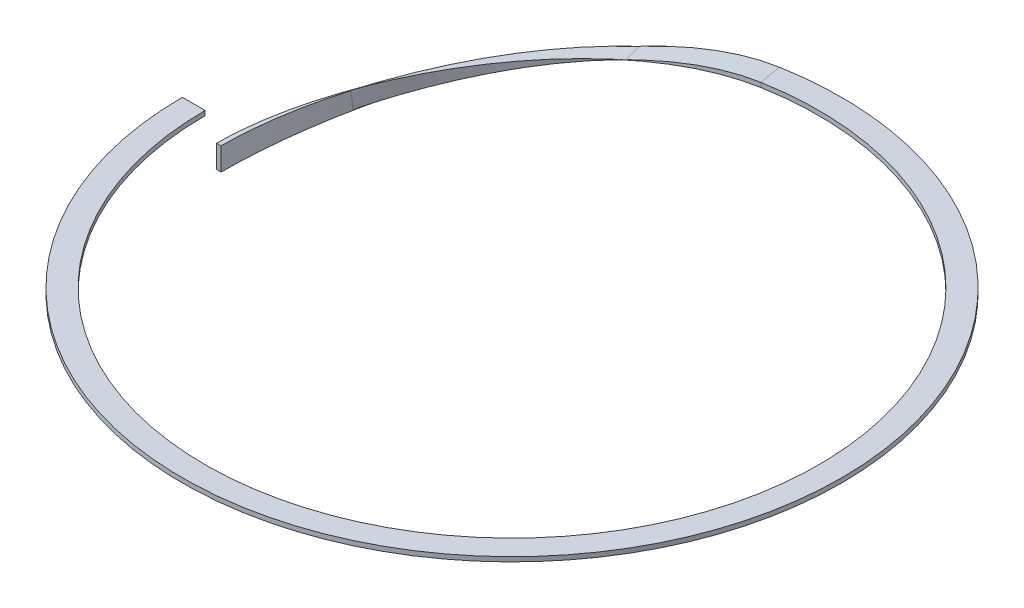
ISO-10303-21;
HEADER;
FILE_DESCRIPTION(('STEP AP214'),'2;1');
FILE_NAME('part.step','',(''),(''),'','','');
FILE_SCHEMA(('AUTOMOTIVE_DESIGN { 1 0 10303 214 1 1 1 1 }'));
ENDSEC;
DATA;
#1=APPLICATION_CONTEXT('core data for automotive mechanical design processes');
#2=APPLICATION_PROTOCOL_DEFINITION('international standard','automotive_design',2000,#1);
#3=PRODUCT_CONTEXT('',#1,'mechanical');
#4=PRODUCT('Part','Part','',(#3));
#5=PRODUCT_RELATED_PRODUCT_CATEGORY('part','',(#4));
#6=PRODUCT_DEFINITION_FORMATION('','',#4);
#7=PRODUCT_DEFINITION_CONTEXT('part definition',#1,'design');
#8=PRODUCT_DEFINITION('design','',#6,#7);
#9=PRODUCT_DEFINITION_SHAPE('','',#8);
#10=(LENGTH_UNIT() NAMED_UNIT(*) SI_UNIT(.MILLI.,.METRE.));
#11=(NAMED_UNIT(*) PLANE_ANGLE_UNIT() SI_UNIT($,.RADIAN.));
#12=(NAMED_UNIT(*) SI_UNIT($,.STERADIAN.) SOLID_ANGLE_UNIT());
#13=UNCERTAINTY_MEASURE_WITH_UNIT(LENGTH_MEASURE(1.E-05),#10,'distance_accuracy_value','');
#14=(GEOMETRIC_REPRESENTATION_CONTEXT(3) GLOBAL_UNCERTAINTY_ASSIGNED_CONTEXT((#13)) GLOBAL_UNIT_ASSIGNED_CONTEXT((#10,
#11,#12)) REPRESENTATION_CONTEXT('',''));
#15=CARTESIAN_POINT('',(0.,0.,0.));
#16=DIRECTION('',(0.,0.,1.));
#17=DIRECTION('',(1.,0.,0.));
#18=AXIS2_PLACEMENT_3D('',#15,#16,#17);
#19=CARTESIAN_POINT('',(0.,0.,0.));
#20=DIRECTION('',(0.,-1.,0.));
#21=DIRECTION('',(0.,0.,-1.));
#22=AXIS2_PLACEMENT_3D('',#19,#20,#21);
#23=CYLINDRICAL_SURFACE('',#22,135.);
#24=CARTESIAN_POINT('',(0.,-0.999999999999994,0.));
#25=DIRECTION('',(0.,-1.,0.));
#26=DIRECTION('',(0.,0.,-1.));
#27=AXIS2_PLACEMENT_3D('',#24,#25,#26);
#28=CIRCLE('',#27,135.);
#29=CARTESIAN_POINT('',(-23.4425039850371,-0.999999999999994,-132.949046656648));
#30=VERTEX_POINT('',#29);
#31=CARTESIAN_POINT('',(-135.,-0.999999999999994,0.));
#32=VERTEX_POINT('',#31);
#33=EDGE_CURVE('E12',#30,#32,#28,.T.);
#34=ORIENTED_EDGE('',*,*,#33,.T.);
#35=DIRECTION('',(0.,1.,0.));
#36=VECTOR('',#35,1.);
#37=CARTESIAN_POINT('',(-135.,-0.999999999999994,0.));
#38=LINE('',#37,#36);
#39=CARTESIAN_POINT('',(-135.,1.00000000000001,0.));
#40=VERTEX_POINT('',#39);
#41=EDGE_CURVE('E187',#32,#40,#38,.T.);
#42=ORIENTED_EDGE('',*,*,#41,.T.);
#43=CARTESIAN_POINT('',(0.,1.00000000000001,0.));
#44=DIRECTION('',(0.,-1.,0.));
#45=DIRECTION('',(0.,0.,-1.));
#46=AXIS2_PLACEMENT_3D('',#43,#44,#45);
#47=CIRCLE('',#46,135.);
#48=CARTESIAN_POINT('',(-23.4425039850371,1.00000000000001,-132.949046656648));
#49=VERTEX_POINT('',#48);
#50=EDGE_CURVE('E119',#49,#40,#47,.T.);
#51=ORIENTED_EDGE('',*,*,#50,.F.);
#52=DIRECTION('',(0.,-1.,0.));
#53=VECTOR('',#52,1.);
#54=CARTESIAN_POINT('',(-23.4425039850371,0.,-132.949046656648));
#55=LINE('',#54,#53);
#56=EDGE_CURVE('E285',#30,#49,#55,.F.);
#57=ORIENTED_EDGE('',*,*,#56,.F.);
#58=EDGE_LOOP('',(#34,#42,#51,#57));
#59=FACE_BOUND('',#58,.T.);
#60=ADVANCED_FACE('F90',(#59),#23,.F.);
#61=CARTESIAN_POINT('',(-25.1789857617065,-0.999999999999994,-142.79712418677));
#62=DIRECTION('',(0.,1.,0.));
#63=DIRECTION('',(0.,0.,1.));
#64=AXIS2_PLACEMENT_3D('',#61,#62,#63);
#65=PLANE('',#64);
#66=CARTESIAN_POINT('',(0.,-0.999999999999994,0.));
#67=DIRECTION('',(0.,-1.,0.));
#68=DIRECTION('',(0.,0.,-1.));
#69=AXIS2_PLACEMENT_3D('',#66,#67,#68);
#70=CIRCLE('',#69,145.);
#71=CARTESIAN_POINT('',(-25.1789857617065,-0.999999999999994,-142.79712418677));
#72=VERTEX_POINT('',#71);
#73=CARTESIAN_POINT('',(-145.,-0.999999999999994,0.));
#74=VERTEX_POINT('',#73);
#75=EDGE_CURVE('E100',#72,#74,#70,.T.);
#76=ORIENTED_EDGE('',*,*,#75,.T.);
#77=DIRECTION('',(1.,0.,0.));
#78=VECTOR('',#77,1.);
#79=CARTESIAN_POINT('',(-145.,-0.999999999999994,0.));
#80=LINE('',#79,#78);
#81=EDGE_CURVE('E323',#74,#32,#80,.T.);
#82=ORIENTED_EDGE('',*,*,#81,.T.);
#83=ORIENTED_EDGE('',*,*,#33,.F.);
#84=DIRECTION('',(-0.173648177666941,0.,-0.984807753012206));
#85=VECTOR('',#84,1.);
#86=CARTESIAN_POINT('',(-23.4425039850371,-0.999999999999994,-132.949046656648));
#87=LINE('',#86,#85);
#88=EDGE_CURVE('E330',#72,#30,#87,.F.);
#89=ORIENTED_EDGE('',*,*,#88,.F.);
#90=EDGE_LOOP('',(#76,#82,#83,#89));
#91=FACE_BOUND('',#90,.T.);
#92=ADVANCED_FACE('F92',(#91),#65,.F.);
#93=CARTESIAN_POINT('',(0.,0.,0.));
#94=DIRECTION('',(0.,-1.,0.));
#95=DIRECTION('',(0.,0.,-1.));
#96=AXIS2_PLACEMENT_3D('',#93,#94,#95);
#97=CYLINDRICAL_SURFACE('',#96,145.);
#98=CARTESIAN_POINT('',(0.,1.00000000000001,0.));
#99=DIRECTION('',(0.,-1.,0.));
#100=DIRECTION('',(0.,0.,-1.));
#101=AXIS2_PLACEMENT_3D('',#98,#99,#100);
#102=CIRCLE('',#101,145.);
#103=CARTESIAN_POINT('',(-25.1789857617065,1.00000000000001,-142.79712418677));
#104=VERTEX_POINT('',#103);
#105=CARTESIAN_POINT('',(-145.,1.00000000000001,0.));
#106=VERTEX_POINT('',#105);
#107=EDGE_CURVE('E328',#104,#106,#102,.T.);
#108=ORIENTED_EDGE('',*,*,#107,.T.);
#109=DIRECTION('',(0.,-1.,0.));
#110=VECTOR('',#109,1.);
#111=CARTESIAN_POINT('',(-145.,-0.999999999999994,0.));
#112=LINE('',#111,#110);
#113=EDGE_CURVE('E319',#106,#74,#112,.T.);
#114=ORIENTED_EDGE('',*,*,#113,.T.);
#115=ORIENTED_EDGE('',*,*,#75,.F.);
#116=DIRECTION('',(0.,-1.,0.));
#117=VECTOR('',#116,1.);
#118=CARTESIAN_POINT('',(-25.1789857617066,0.,-142.79712418677));
#119=LINE('',#118,#117);
#120=EDGE_CURVE('E94',#104,#72,#119,.T.);
#121=ORIENTED_EDGE('',*,*,#120,.F.);
#122=EDGE_LOOP('',(#108,#114,#115,#121));
#123=FACE_BOUND('',#122,.T.);
#124=ADVANCED_FACE('F336',(#123),#97,.T.);
#125=CARTESIAN_POINT('',(-25.1789857617065,1.00000000000001,-142.79712418677));
#126=DIRECTION('',(0.,-1.,0.));
#127=DIRECTION('',(0.,0.,-1.));
#128=AXIS2_PLACEMENT_3D('',#125,#126,#127);
#129=PLANE('',#128);
#130=DIRECTION('',(0.173648177666941,0.,0.984807753012206));
#131=VECTOR('',#130,1.);
#132=CARTESIAN_POINT('',(-25.1789857617065,1.00000000000001,-142.79712418677));
#133=LINE('',#132,#131);
#134=EDGE_CURVE('E333',#49,#104,#133,.F.);
#135=ORIENTED_EDGE('',*,*,#134,.F.);
#136=ORIENTED_EDGE('',*,*,#50,.T.);
#137=DIRECTION('',(-1.,0.,0.));
#138=VECTOR('',#137,1.);
#139=CARTESIAN_POINT('',(-145.,1.00000000000001,0.));
#140=LINE('',#139,#138);
#141=EDGE_CURVE('E316',#40,#106,#140,.T.);
#142=ORIENTED_EDGE('',*,*,#141,.T.);
#143=ORIENTED_EDGE('',*,*,#107,.F.);
#144=EDGE_LOOP('',(#135,#136,#142,#143));
#145=FACE_BOUND('',#144,.T.);
#146=ADVANCED_FACE('F334',(#145),#129,.F.);
#147=CARTESIAN_POINT('',(0.,0.,0.));
#148=DIRECTION('',(0.,0.,-1.));
#149=DIRECTION('',(-1.,0.,0.));
#150=AXIS2_PLACEMENT_3D('',#147,#148,#149);
#151=PLANE('',#150);
#152=ORIENTED_EDGE('',*,*,#41,.F.);
#153=ORIENTED_EDGE('',*,*,#81,.F.);
#154=ORIENTED_EDGE('',*,*,#113,.F.);
#155=ORIENTED_EDGE('',*,*,#141,.F.);
#156=EDGE_LOOP('',(#152,#153,#154,#155));
#157=FACE_BOUND('',#156,.T.);
#158=ADVANCED_FACE('F198',(#157),#151,.T.);
#159=CARTESIAN_POINT('',(0.,0.,0.));
#160=DIRECTION('',(0.,0.,-1.));
#161=DIRECTION('',(-1.,0.,0.));
#162=AXIS2_PLACEMENT_3D('',#159,#160,#161);
#163=PLANE('',#162);
#164=DIRECTION('',(0.,1.,0.));
#165=VECTOR('',#164,1.);
#166=CARTESIAN_POINT('',(-128.,-8.99999999999999,0.));
#167=LINE('',#166,#165);
#168=CARTESIAN_POINT('',(-128.,-19.,0.));
#169=VERTEX_POINT('',#168);
#170=CARTESIAN_POINT('',(-128.,-8.99999999999999,0.));
#171=VERTEX_POINT('',#170);
#172=EDGE_CURVE('E151',#169,#171,#167,.T.);
#173=ORIENTED_EDGE('',*,*,#172,.T.);
#174=DIRECTION('',(-1.,0.,0.));
#175=VECTOR('',#174,1.);
#176=CARTESIAN_POINT('',(-128.,-8.99999999999999,0.));
#177=LINE('',#176,#175);
#178=CARTESIAN_POINT('',(-130.,-8.99999999999999,0.));
#179=VERTEX_POINT('',#178);
#180=EDGE_CURVE('E161',#171,#179,#177,.T.);
#181=ORIENTED_EDGE('',*,*,#180,.T.);
#182=DIRECTION('',(0.,-1.,0.));
#183=VECTOR('',#182,1.);
#184=CARTESIAN_POINT('',(-130.,-8.99999999999999,0.));
#185=LINE('',#184,#183);
#186=CARTESIAN_POINT('',(-130.,-19.,0.));
#187=VERTEX_POINT('',#186);
#188=EDGE_CURVE('E169',#179,#187,#185,.T.);
#189=ORIENTED_EDGE('',*,*,#188,.T.);
#190=DIRECTION('',(1.,0.,0.));
#191=VECTOR('',#190,1.);
#192=CARTESIAN_POINT('',(-128.,-19.,0.));
#193=LINE('',#192,#191);
#194=EDGE_CURVE('E176',#187,#169,#193,.T.);
#195=ORIENTED_EDGE('',*,*,#194,.T.);
#196=EDGE_LOOP('',(#173,#181,#189,#195));
#197=FACE_BOUND('',#196,.T.);
#198=ADVANCED_FACE('F174',(#197),#163,.F.);
#199=CARTESIAN_POINT('',(-23.4425039850371,1.00000000000001,-132.949046656648));
#200=CARTESIAN_POINT('',(-79.7576168349461,1.00000000000001,-123.019172839566));
#201=CARTESIAN_POINT('',(-130.,-19.,-57.1838642391466));
#202=CARTESIAN_POINT('',(-130.,-19.,0.));
#203=CARTESIAN_POINT('',(-24.0213312439269,1.00000000000001,-136.231739166689));
#204=CARTESIAN_POINT('',(-80.9431878305732,1.00000000000001,-126.194880058444));
#205=CARTESIAN_POINT('',(-129.333333333333,-19.,-57.7999679760246));
#206=CARTESIAN_POINT('',(-129.333333333333,-19.,0.));
#207=CARTESIAN_POINT('',(-24.6001585028167,1.00000000000001,-139.514431676729));
#208=CARTESIAN_POINT('',(-82.1287588262002,1.00000000000001,-129.370587277322));
#209=CARTESIAN_POINT('',(-128.666666666667,-19.,-58.4160717129026));
#210=CARTESIAN_POINT('',(-128.666666666667,-19.,0.));
#211=CARTESIAN_POINT('',(-25.1789857617065,1.00000000000001,-142.79712418677));
#212=CARTESIAN_POINT('',(-83.3143298218273,1.00000000000001,-132.5462944962));
#213=CARTESIAN_POINT('',(-128.,-19.,-59.0321754497806));
#214=CARTESIAN_POINT('',(-128.,-19.,0.));
#215=B_SPLINE_SURFACE_WITH_KNOTS('',3,3,((#199,#200,#201,#202),(#203,#204,#205,#206),(#207,#208,
#209,#210),(#211,#212,#213,#214)),.UNSPECIFIED.,.F.,.F.,.F.,(4,4),(4,4),(0.,1.),(0.,1.),.UNSPECIFIED.);
#216=CARTESIAN_POINT('',(-25.1789857617065,1.00000000000001,-142.79712418677));
#217=CARTESIAN_POINT('',(-83.3143298218273,1.00000000000001,-132.5462944962));
#218=CARTESIAN_POINT('',(-128.,-19.,-59.0321754497806));
#219=CARTESIAN_POINT('',(-128.,-19.,0.));
#220=B_SPLINE_CURVE_WITH_KNOTS('',3,(#216,#217,#218,#219),.UNSPECIFIED.,.F.,.F.,(4,4),(0.,1.),.UNSPECIFIED.);
#221=EDGE_CURVE('E158',#104,#169,#220,.T.);
#222=CARTESIAN_POINT('',(-23.4425039850371,1.00000000000001,-132.949046656648));
#223=CARTESIAN_POINT('',(-79.7576168349461,1.00000000000001,-123.019172839566));
#224=CARTESIAN_POINT('',(-130.,-19.,-57.1838642391466));
#225=CARTESIAN_POINT('',(-130.,-19.,0.));
#226=B_SPLINE_CURVE_WITH_KNOTS('',3,(#222,#223,#224,#225),.UNSPECIFIED.,.F.,.F.,(4,4),(0.,1.),.UNSPECIFIED.);
#227=EDGE_CURVE('E168',#187,#49,#226,.F.);
#228=ORIENTED_EDGE('',*,*,#134,.T.);
#229=ORIENTED_EDGE('',*,*,#221,.T.);
#230=ORIENTED_EDGE('',*,*,#194,.F.);
#231=ORIENTED_EDGE('',*,*,#227,.T.);
#232=EDGE_LOOP('',(#228,#229,#230,#231));
#233=FACE_BOUND('',#232,.T.);
#234=ADVANCED_FACE('F197',(#233),#215,.T.);
#235=CARTESIAN_POINT('',(-25.1789857617065,1.00000000000001,-142.79712418677));
#236=CARTESIAN_POINT('',(-83.3143298218273,1.00000000000001,-132.5462944962));
#237=CARTESIAN_POINT('',(-128.,-19.,-59.0321754497806));
#238=CARTESIAN_POINT('',(-128.,-19.,0.));
#239=CARTESIAN_POINT('',(-25.1789857617065,0.33333333333334,-142.79712418677));
#240=CARTESIAN_POINT('',(-83.210247718438,0.33333333333334,-132.564646979237));
#241=CARTESIAN_POINT('',(-128.,-15.6666666666667,-58.9264877121781));
#242=CARTESIAN_POINT('',(-128.,-15.6666666666667,0.));
#243=CARTESIAN_POINT('',(-25.1789857617065,-0.333333333333327,-142.79712418677));
#244=CARTESIAN_POINT('',(-83.1061656150487,-0.333333333333327,-132.582999462273));
#245=CARTESIAN_POINT('',(-128.,-12.3333333333333,-58.8207999745756));
#246=CARTESIAN_POINT('',(-128.,-12.3333333333333,0.));
#247=CARTESIAN_POINT('',(-25.1789857617065,-0.999999999999994,-142.79712418677));
#248=CARTESIAN_POINT('',(-83.0020835116595,-0.999999999999994,-132.60135194531));
#249=CARTESIAN_POINT('',(-128.,-8.99999999999999,-58.7151122369731));
#250=CARTESIAN_POINT('',(-128.,-8.99999999999999,0.));
#251=B_SPLINE_SURFACE_WITH_KNOTS('',3,3,((#235,#236,#237,#238),(#239,#240,#241,#242),(#243,#244,
#245,#246),(#247,#248,#249,#250)),.UNSPECIFIED.,.F.,.F.,.F.,(4,4),(4,4),(0.,1.),(0.,1.),.UNSPECIFIED.);
#252=CARTESIAN_POINT('',(-25.1789857617065,-0.999999999999994,-142.79712418677));
#253=CARTESIAN_POINT('',(-83.0020835116595,-0.999999999999994,-132.60135194531));
#254=CARTESIAN_POINT('',(-128.,-8.99999999999999,-58.7151122369731));
#255=CARTESIAN_POINT('',(-128.,-8.99999999999999,0.));
#256=B_SPLINE_CURVE_WITH_KNOTS('',3,(#252,#253,#254,#255),.UNSPECIFIED.,.F.,.F.,(4,4),(0.,1.),.UNSPECIFIED.);
#257=EDGE_CURVE('E146',#72,#171,#256,.T.);
#258=ORIENTED_EDGE('',*,*,#120,.T.);
#259=ORIENTED_EDGE('',*,*,#257,.T.);
#260=ORIENTED_EDGE('',*,*,#172,.F.);
#261=ORIENTED_EDGE('',*,*,#221,.F.);
#262=EDGE_LOOP('',(#258,#259,#260,#261));
#263=FACE_BOUND('',#262,.T.);
#264=ADVANCED_FACE('F148',(#263),#251,.T.);
#265=CARTESIAN_POINT('',(-23.4425039850371,-0.999999999999994,-132.949046656648));
#266=CARTESIAN_POINT('',(-79.435220830266,-0.999999999999994,-123.076019953664));
#267=CARTESIAN_POINT('',(-130.,-8.99999999999999,-56.8564947564288));
#268=CARTESIAN_POINT('',(-130.,-8.99999999999999,0.));
#269=CARTESIAN_POINT('',(-23.4425039850371,-0.333333333333327,-132.949046656648));
#270=CARTESIAN_POINT('',(-79.5426861651594,-0.333333333333327,-123.057070915631));
#271=CARTESIAN_POINT('',(-130.,-12.3333333333333,-56.9656179173348));
#272=CARTESIAN_POINT('',(-130.,-12.3333333333333,0.));
#273=CARTESIAN_POINT('',(-23.4425039850371,0.33333333333334,-132.949046656648));
#274=CARTESIAN_POINT('',(-79.6501515000528,0.33333333333334,-123.038121877599));
#275=CARTESIAN_POINT('',(-130.,-15.6666666666667,-57.0747410782407));
#276=CARTESIAN_POINT('',(-130.,-15.6666666666667,0.));
#277=CARTESIAN_POINT('',(-23.4425039850371,1.00000000000001,-132.949046656648));
#278=CARTESIAN_POINT('',(-79.7576168349461,1.00000000000001,-123.019172839566));
#279=CARTESIAN_POINT('',(-130.,-19.,-57.1838642391466));
#280=CARTESIAN_POINT('',(-130.,-19.,0.));
#281=B_SPLINE_SURFACE_WITH_KNOTS('',3,3,((#265,#266,#267,#268),(#269,#270,#271,#272),(#273,#274,
#275,#276),(#277,#278,#279,#280)),.UNSPECIFIED.,.F.,.F.,.F.,(4,4),(4,4),(0.,1.),(0.,1.),.UNSPECIFIED.);
#282=CARTESIAN_POINT('',(-23.4425039850371,-0.999999999999994,-132.949046656648));
#283=CARTESIAN_POINT('',(-79.435220830266,-0.999999999999994,-123.076019953664));
#284=CARTESIAN_POINT('',(-130.,-8.99999999999999,-56.8564947564288));
#285=CARTESIAN_POINT('',(-130.,-8.99999999999999,0.));
#286=B_SPLINE_CURVE_WITH_KNOTS('',3,(#282,#283,#284,#285),.UNSPECIFIED.,.F.,.F.,(4,4),(0.,1.),.UNSPECIFIED.);
#287=EDGE_CURVE('E157',#30,#179,#286,.T.);
#288=ORIENTED_EDGE('',*,*,#56,.T.);
#289=ORIENTED_EDGE('',*,*,#227,.F.);
#290=ORIENTED_EDGE('',*,*,#188,.F.);
#291=ORIENTED_EDGE('',*,*,#287,.F.);
#292=EDGE_LOOP('',(#288,#289,#290,#291));
#293=FACE_BOUND('',#292,.T.);
#294=ADVANCED_FACE('F242',(#293),#281,.T.);
#295=CARTESIAN_POINT('',(-25.1789857617065,-0.999999999999994,-142.79712418677));
#296=CARTESIAN_POINT('',(-83.0020835116595,-0.999999999999994,-132.60135194531));
#297=CARTESIAN_POINT('',(-128.,-8.99999999999999,-58.7151122369731));
#298=CARTESIAN_POINT('',(-128.,-8.99999999999999,0.));
#299=CARTESIAN_POINT('',(-24.6001585028167,-0.999999999999994,-139.514431676729));
#300=CARTESIAN_POINT('',(-81.8131292845283,-0.999999999999994,-129.426241281428));
#301=CARTESIAN_POINT('',(-128.666666666667,-8.99999999999999,-58.0955730767917));
#302=CARTESIAN_POINT('',(-128.666666666667,-8.99999999999999,0.));
#303=CARTESIAN_POINT('',(-24.0213312439269,-0.999999999999994,-136.231739166689));
#304=CARTESIAN_POINT('',(-80.6241750573972,-0.999999999999994,-126.251130617546));
#305=CARTESIAN_POINT('',(-129.333333333333,-8.99999999999999,-57.4760339166102));
#306=CARTESIAN_POINT('',(-129.333333333333,-8.99999999999999,0.));
#307=CARTESIAN_POINT('',(-23.4425039850371,-0.999999999999994,-132.949046656648));
#308=CARTESIAN_POINT('',(-79.435220830266,-0.999999999999994,-123.076019953664));
#309=CARTESIAN_POINT('',(-130.,-8.99999999999999,-56.8564947564288));
#310=CARTESIAN_POINT('',(-130.,-8.99999999999999,0.));
#311=B_SPLINE_SURFACE_WITH_KNOTS('',3,3,((#295,#296,#297,#298),(#299,#300,#301,#302),(#303,#304,
#305,#306),(#307,#308,#309,#310)),.UNSPECIFIED.,.F.,.F.,.F.,(4,4),(4,4),(0.,1.),(0.,1.),.UNSPECIFIED.);
#312=ORIENTED_EDGE('',*,*,#88,.T.);
#313=ORIENTED_EDGE('',*,*,#287,.T.);
#314=ORIENTED_EDGE('',*,*,#180,.F.);
#315=ORIENTED_EDGE('',*,*,#257,.F.);
#316=EDGE_LOOP('',(#312,#313,#314,#315));
#317=FACE_BOUND('',#316,.T.);
#318=ADVANCED_FACE('F163',(#317),#311,.T.);
#319=CLOSED_SHELL('',(#60,#92,#124,#146,#158,#198,#234,#264,#294,#318));
#320=MANIFOLD_SOLID_BREP('B2',#319);
#321=ADVANCED_BREP_SHAPE_REPRESENTATION('',(#18,#320),#14);
#322=SHAPE_DEFINITION_REPRESENTATION(#9,#321);
ENDSEC;
END-ISO-10303-21;
